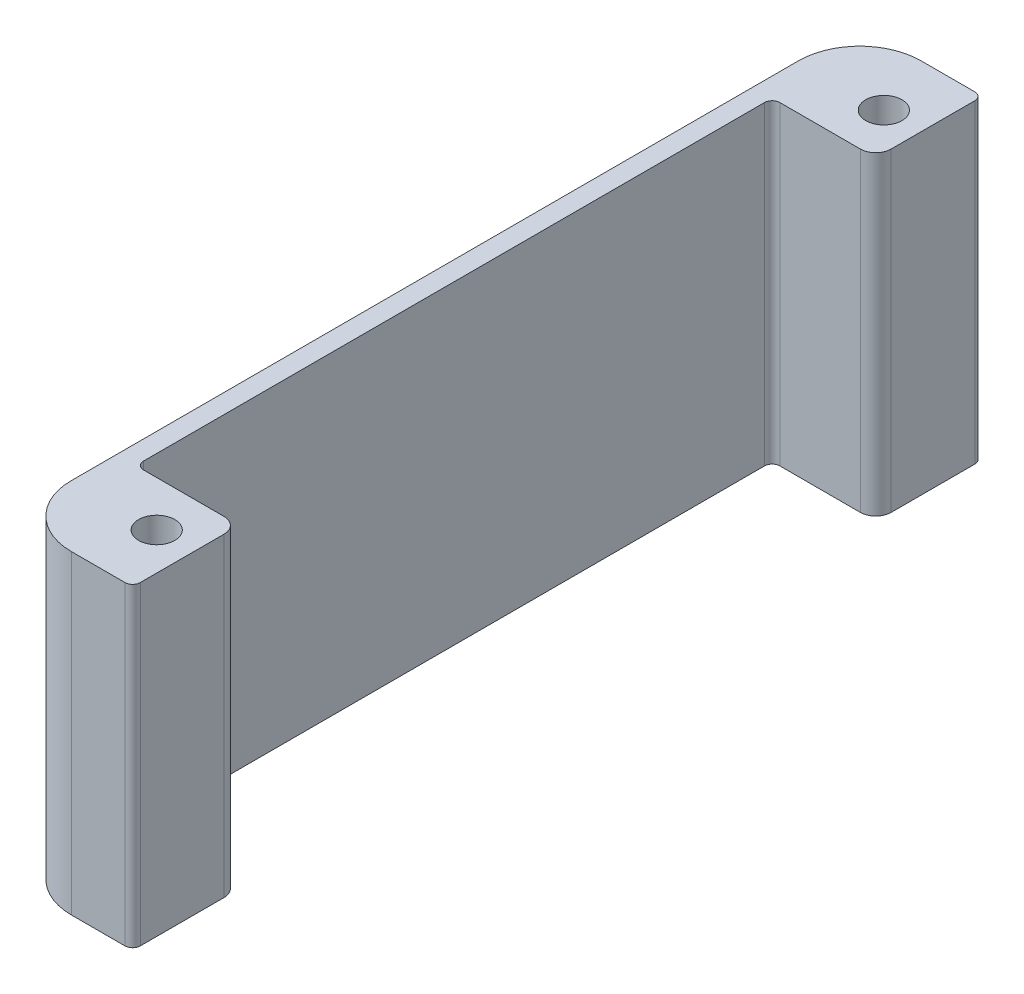
ISO-10303-21;
HEADER;
FILE_DESCRIPTION(('STEP AP214'),'2;1');
FILE_NAME('part.step','',(''),(''),'','','');
FILE_SCHEMA(('AUTOMOTIVE_DESIGN { 1 0 10303 214 1 1 1 1 }'));
ENDSEC;
DATA;
#1=APPLICATION_CONTEXT('core data for automotive mechanical design processes');
#2=APPLICATION_PROTOCOL_DEFINITION('international standard','automotive_design',2000,#1);
#3=PRODUCT_CONTEXT('',#1,'mechanical');
#4=PRODUCT('Part','Part','',(#3));
#5=PRODUCT_RELATED_PRODUCT_CATEGORY('part','',(#4));
#6=PRODUCT_DEFINITION_FORMATION('','',#4);
#7=PRODUCT_DEFINITION_CONTEXT('part definition',#1,'design');
#8=PRODUCT_DEFINITION('design','',#6,#7);
#9=PRODUCT_DEFINITION_SHAPE('','',#8);
#10=(LENGTH_UNIT() NAMED_UNIT(*) SI_UNIT(.MILLI.,.METRE.));
#11=(NAMED_UNIT(*) PLANE_ANGLE_UNIT() SI_UNIT($,.RADIAN.));
#12=(NAMED_UNIT(*) SI_UNIT($,.STERADIAN.) SOLID_ANGLE_UNIT());
#13=UNCERTAINTY_MEASURE_WITH_UNIT(LENGTH_MEASURE(1.E-05),#10,'distance_accuracy_value','');
#14=(GEOMETRIC_REPRESENTATION_CONTEXT(3) GLOBAL_UNCERTAINTY_ASSIGNED_CONTEXT((#13)) GLOBAL_UNIT_ASSIGNED_CONTEXT((#10,
#11,#12)) REPRESENTATION_CONTEXT('',''));
#15=CARTESIAN_POINT('',(0.,0.,0.));
#16=DIRECTION('',(0.,0.,1.));
#17=DIRECTION('',(1.,0.,0.));
#18=AXIS2_PLACEMENT_3D('',#15,#16,#17);
#19=CARTESIAN_POINT('',(3.175,52.09999994,0.));
#20=DIRECTION('',(-1.,0.,0.));
#21=DIRECTION('',(0.,0.,1.));
#22=AXIS2_PLACEMENT_3D('',#19,#20,#21);
#23=PLANE('',#22);
#24=DIRECTION('',(0.,0.,-1.));
#25=VECTOR('',#24,1.);
#26=CARTESIAN_POINT('',(3.175,52.09999994,0.));
#27=LINE('',#26,#25);
#28=CARTESIAN_POINT('',(3.175,52.09999994,-8.7836403590184));
#29=VERTEX_POINT('',#28);
#30=CARTESIAN_POINT('',(3.175,52.09999994,-111.586959640982));
#31=VERTEX_POINT('',#30);
#32=EDGE_CURVE('E191',#29,#31,#27,.T.);
#33=ORIENTED_EDGE('',*,*,#32,.F.);
#34=DIRECTION('',(0.,1.,0.));
#35=VECTOR('',#34,1.);
#36=CARTESIAN_POINT('',(3.175,52.09999994,-8.7836403590184));
#37=LINE('',#36,#35);
#38=CARTESIAN_POINT('',(3.175,0.,-8.7836403590184));
#39=VERTEX_POINT('',#38);
#40=EDGE_CURVE('E240',#29,#39,#37,.F.);
#41=ORIENTED_EDGE('',*,*,#40,.T.);
#42=DIRECTION('',(0.,0.,-1.));
#43=VECTOR('',#42,1.);
#44=CARTESIAN_POINT('',(3.175,0.,0.));
#45=LINE('',#44,#43);
#46=CARTESIAN_POINT('',(3.175,0.,-111.586959640982));
#47=VERTEX_POINT('',#46);
#48=EDGE_CURVE('E179',#39,#47,#45,.T.);
#49=ORIENTED_EDGE('',*,*,#48,.T.);
#50=DIRECTION('',(0.,1.,0.));
#51=VECTOR('',#50,1.);
#52=CARTESIAN_POINT('',(3.175,52.09999994,-111.586959640982));
#53=LINE('',#52,#51);
#54=EDGE_CURVE('E227',#47,#31,#53,.T.);
#55=ORIENTED_EDGE('',*,*,#54,.T.);
#56=EDGE_LOOP('',(#33,#41,#49,#55));
#57=FACE_BOUND('',#56,.T.);
#58=ADVANCED_FACE('F38',(#57),#23,.F.);
#59=CARTESIAN_POINT('',(20.32,52.09999994,0.));
#60=DIRECTION('',(1.,0.,0.));
#61=DIRECTION('',(0.,0.,-1.));
#62=AXIS2_PLACEMENT_3D('',#59,#60,#61);
#63=PLANE('',#62);
#64=DIRECTION('',(0.,0.,1.));
#65=VECTOR('',#64,1.);
#66=CARTESIAN_POINT('',(20.32,0.,0.));
#67=LINE('',#66,#65);
#68=CARTESIAN_POINT('',(20.32,0.,-129.2606));
#69=VERTEX_POINT('',#68);
#70=CARTESIAN_POINT('',(20.32,0.,-115.396959640982));
#71=VERTEX_POINT('',#70);
#72=EDGE_CURVE('E194',#69,#71,#67,.T.);
#73=ORIENTED_EDGE('',*,*,#72,.F.);
#74=DIRECTION('',(0.,-1.,0.));
#75=VECTOR('',#74,1.);
#76=CARTESIAN_POINT('',(20.32,52.09999994,-129.2606));
#77=LINE('',#76,#75);
#78=CARTESIAN_POINT('',(20.32,52.09999994,-129.2606));
#79=VERTEX_POINT('',#78);
#80=EDGE_CURVE('E261',#69,#79,#77,.F.);
#81=ORIENTED_EDGE('',*,*,#80,.T.);
#82=DIRECTION('',(0.,0.,1.));
#83=VECTOR('',#82,1.);
#84=CARTESIAN_POINT('',(20.32,52.09999994,0.));
#85=LINE('',#84,#83);
#86=CARTESIAN_POINT('',(20.32,52.09999994,-115.396959640982));
#87=VERTEX_POINT('',#86);
#88=EDGE_CURVE('E177',#79,#87,#85,.T.);
#89=ORIENTED_EDGE('',*,*,#88,.T.);
#90=DIRECTION('',(0.,1.,0.));
#91=VECTOR('',#90,1.);
#92=CARTESIAN_POINT('',(20.32,0.,-115.396959640982));
#93=LINE('',#92,#91);
#94=EDGE_CURVE('E221',#87,#71,#93,.F.);
#95=ORIENTED_EDGE('',*,*,#94,.T.);
#96=EDGE_LOOP('',(#73,#81,#89,#95));
#97=FACE_BOUND('',#96,.T.);
#98=ADVANCED_FACE('F302',(#97),#63,.T.);
#99=CARTESIAN_POINT('',(0.,52.09999994,-130.5306));
#100=DIRECTION('',(0.,0.,-1.));
#101=DIRECTION('',(-1.,0.,0.));
#102=AXIS2_PLACEMENT_3D('',#99,#100,#101);
#103=PLANE('',#102);
#104=DIRECTION('',(1.,0.,0.));
#105=VECTOR('',#104,1.);
#106=CARTESIAN_POINT('',(0.,52.09999994,-130.5306));
#107=LINE('',#106,#105);
#108=CARTESIAN_POINT('',(10.16,52.09999994,-130.5306));
#109=VERTEX_POINT('',#108);
#110=CARTESIAN_POINT('',(19.05,52.09999994,-130.5306));
#111=VERTEX_POINT('',#110);
#112=EDGE_CURVE('E155',#109,#111,#107,.T.);
#113=ORIENTED_EDGE('',*,*,#112,.T.);
#114=DIRECTION('',(0.,-1.,0.));
#115=VECTOR('',#114,1.);
#116=CARTESIAN_POINT('',(19.05,52.09999994,-130.5306));
#117=LINE('',#116,#115);
#118=CARTESIAN_POINT('',(19.05,0.,-130.5306));
#119=VERTEX_POINT('',#118);
#120=EDGE_CURVE('E259',#111,#119,#117,.T.);
#121=ORIENTED_EDGE('',*,*,#120,.T.);
#122=DIRECTION('',(1.,0.,0.));
#123=VECTOR('',#122,1.);
#124=CARTESIAN_POINT('',(0.,0.,-130.5306));
#125=LINE('',#124,#123);
#126=CARTESIAN_POINT('',(10.16,0.,-130.5306));
#127=VERTEX_POINT('',#126);
#128=EDGE_CURVE('E158',#127,#119,#125,.T.);
#129=ORIENTED_EDGE('',*,*,#128,.F.);
#130=DIRECTION('',(0.,-1.,0.));
#131=VECTOR('',#130,1.);
#132=CARTESIAN_POINT('',(10.16,52.09999994,-130.5306));
#133=LINE('',#132,#131);
#134=EDGE_CURVE('E150',#109,#127,#133,.T.);
#135=ORIENTED_EDGE('',*,*,#134,.F.);
#136=EDGE_LOOP('',(#113,#121,#129,#135));
#137=FACE_BOUND('',#136,.T.);
#138=ADVANCED_FACE('F152',(#137),#103,.T.);
#139=CARTESIAN_POINT('',(10.16,52.09999994,-120.3706));
#140=DIRECTION('',(0.,-1.,0.));
#141=DIRECTION('',(0.,0.,-1.));
#142=AXIS2_PLACEMENT_3D('',#139,#140,#141);
#143=CYLINDRICAL_SURFACE('',#142,10.16);
#144=CARTESIAN_POINT('',(10.16,0.,-120.3706));
#145=DIRECTION('',(0.,1.,0.));
#146=DIRECTION('',(0.,0.,1.));
#147=AXIS2_PLACEMENT_3D('',#144,#145,#146);
#148=CIRCLE('',#147,10.16);
#149=CARTESIAN_POINT('',(0.,0.,-120.3706));
#150=VERTEX_POINT('',#149);
#151=EDGE_CURVE('E198',#127,#150,#148,.T.);
#152=ORIENTED_EDGE('',*,*,#151,.T.);
#153=DIRECTION('',(0.,-1.,0.));
#154=VECTOR('',#153,1.);
#155=CARTESIAN_POINT('',(0.,52.09999994,-120.3706));
#156=LINE('',#155,#154);
#157=CARTESIAN_POINT('',(0.,52.09999994,-120.3706));
#158=VERTEX_POINT('',#157);
#159=EDGE_CURVE('E163',#158,#150,#156,.T.);
#160=ORIENTED_EDGE('',*,*,#159,.F.);
#161=CARTESIAN_POINT('',(10.16,52.09999994,-120.3706));
#162=DIRECTION('',(0.,1.,0.));
#163=DIRECTION('',(0.,0.,1.));
#164=AXIS2_PLACEMENT_3D('',#161,#162,#163);
#165=CIRCLE('',#164,10.16);
#166=EDGE_CURVE('E166',#109,#158,#165,.T.);
#167=ORIENTED_EDGE('',*,*,#166,.F.);
#168=ORIENTED_EDGE('',*,*,#134,.T.);
#169=EDGE_LOOP('',(#152,#160,#167,#168));
#170=FACE_BOUND('',#169,.T.);
#171=ADVANCED_FACE('F167',(#170),#143,.T.);
#172=CARTESIAN_POINT('',(0.,52.09999994,0.));
#173=DIRECTION('',(-1.,0.,0.));
#174=DIRECTION('',(0.,0.,1.));
#175=AXIS2_PLACEMENT_3D('',#172,#173,#174);
#176=PLANE('',#175);
#177=DIRECTION('',(0.,0.,-1.));
#178=VECTOR('',#177,1.);
#179=CARTESIAN_POINT('',(0.,0.,0.));
#180=LINE('',#179,#178);
#181=CARTESIAN_POINT('',(0.,0.,0.));
#182=VERTEX_POINT('',#181);
#183=EDGE_CURVE('E200',#182,#150,#180,.T.);
#184=ORIENTED_EDGE('',*,*,#183,.F.);
#185=DIRECTION('',(0.,-1.,0.));
#186=VECTOR('',#185,1.);
#187=CARTESIAN_POINT('',(0.,52.09999994,0.));
#188=LINE('',#187,#186);
#189=CARTESIAN_POINT('',(0.,52.09999994,0.));
#190=VERTEX_POINT('',#189);
#191=EDGE_CURVE('E213',#190,#182,#188,.T.);
#192=ORIENTED_EDGE('',*,*,#191,.F.);
#193=DIRECTION('',(0.,0.,-1.));
#194=VECTOR('',#193,1.);
#195=CARTESIAN_POINT('',(0.,52.09999994,0.));
#196=LINE('',#195,#194);
#197=EDGE_CURVE('E170',#190,#158,#196,.T.);
#198=ORIENTED_EDGE('',*,*,#197,.T.);
#199=ORIENTED_EDGE('',*,*,#159,.T.);
#200=EDGE_LOOP('',(#184,#192,#198,#199));
#201=FACE_BOUND('',#200,.T.);
#202=ADVANCED_FACE('F292',(#201),#176,.T.);
#203=CARTESIAN_POINT('',(10.16,52.09999994,0.));
#204=DIRECTION('',(0.,-1.,0.));
#205=DIRECTION('',(0.,0.,-1.));
#206=AXIS2_PLACEMENT_3D('',#203,#204,#205);
#207=CYLINDRICAL_SURFACE('',#206,10.16);
#208=CARTESIAN_POINT('',(10.16,0.,0.));
#209=DIRECTION('',(0.,1.,0.));
#210=DIRECTION('',(0.,0.,1.));
#211=AXIS2_PLACEMENT_3D('',#208,#209,#210);
#212=CIRCLE('',#211,10.16);
#213=CARTESIAN_POINT('',(10.16,0.,10.16));
#214=VERTEX_POINT('',#213);
#215=EDGE_CURVE('E203',#214,#182,#212,.F.);
#216=ORIENTED_EDGE('',*,*,#215,.F.);
#217=DIRECTION('',(0.,-1.,0.));
#218=VECTOR('',#217,1.);
#219=CARTESIAN_POINT('',(10.16,52.09999994,10.16));
#220=LINE('',#219,#218);
#221=CARTESIAN_POINT('',(10.16,52.09999994,10.16));
#222=VERTEX_POINT('',#221);
#223=EDGE_CURVE('E193',#222,#214,#220,.T.);
#224=ORIENTED_EDGE('',*,*,#223,.F.);
#225=CARTESIAN_POINT('',(10.16,52.09999994,0.));
#226=DIRECTION('',(0.,1.,0.));
#227=DIRECTION('',(0.,0.,1.));
#228=AXIS2_PLACEMENT_3D('',#225,#226,#227);
#229=CIRCLE('',#228,10.16);
#230=EDGE_CURVE('E184',#222,#190,#229,.F.);
#231=ORIENTED_EDGE('',*,*,#230,.T.);
#232=ORIENTED_EDGE('',*,*,#191,.T.);
#233=EDGE_LOOP('',(#216,#224,#231,#232));
#234=FACE_BOUND('',#233,.T.);
#235=ADVANCED_FACE('F289',(#234),#207,.T.);
#236=CARTESIAN_POINT('',(0.,52.09999994,10.16));
#237=DIRECTION('',(0.,0.,1.));
#238=DIRECTION('',(1.,0.,0.));
#239=AXIS2_PLACEMENT_3D('',#236,#237,#238);
#240=PLANE('',#239);
#241=DIRECTION('',(-1.,0.,0.));
#242=VECTOR('',#241,1.);
#243=CARTESIAN_POINT('',(0.,0.,10.16));
#244=LINE('',#243,#242);
#245=CARTESIAN_POINT('',(19.05,0.,10.16));
#246=VERTEX_POINT('',#245);
#247=EDGE_CURVE('E206',#246,#214,#244,.T.);
#248=ORIENTED_EDGE('',*,*,#247,.F.);
#249=DIRECTION('',(0.,-1.,0.));
#250=VECTOR('',#249,1.);
#251=CARTESIAN_POINT('',(19.05,52.09999994,10.16));
#252=LINE('',#251,#250);
#253=CARTESIAN_POINT('',(19.05,52.09999994,10.16));
#254=VERTEX_POINT('',#253);
#255=EDGE_CURVE('E253',#246,#254,#252,.F.);
#256=ORIENTED_EDGE('',*,*,#255,.T.);
#257=DIRECTION('',(-1.,0.,0.));
#258=VECTOR('',#257,1.);
#259=CARTESIAN_POINT('',(0.,52.09999994,10.16));
#260=LINE('',#259,#258);
#261=EDGE_CURVE('E187',#254,#222,#260,.T.);
#262=ORIENTED_EDGE('',*,*,#261,.T.);
#263=ORIENTED_EDGE('',*,*,#223,.T.);
#264=EDGE_LOOP('',(#248,#256,#262,#263));
#265=FACE_BOUND('',#264,.T.);
#266=ADVANCED_FACE('F285',(#265),#240,.T.);
#267=CARTESIAN_POINT('',(20.32,52.09999994,0.));
#268=DIRECTION('',(1.,0.,0.));
#269=DIRECTION('',(0.,0.,-1.));
#270=AXIS2_PLACEMENT_3D('',#267,#268,#269);
#271=PLANE('',#270);
#272=DIRECTION('',(0.,0.,1.));
#273=VECTOR('',#272,1.);
#274=CARTESIAN_POINT('',(20.32,0.,0.));
#275=LINE('',#274,#273);
#276=CARTESIAN_POINT('',(20.32,0.,-4.9736403590184));
#277=VERTEX_POINT('',#276);
#278=CARTESIAN_POINT('',(20.32,0.,8.89000000000002));
#279=VERTEX_POINT('',#278);
#280=EDGE_CURVE('E208',#277,#279,#275,.T.);
#281=ORIENTED_EDGE('',*,*,#280,.F.);
#282=DIRECTION('',(0.,1.,0.));
#283=VECTOR('',#282,1.);
#284=CARTESIAN_POINT('',(20.32,52.09999994,-4.9736403590184));
#285=LINE('',#284,#283);
#286=CARTESIAN_POINT('',(20.32,52.09999994,-4.9736403590184));
#287=VERTEX_POINT('',#286);
#288=EDGE_CURVE('E263',#277,#287,#285,.T.);
#289=ORIENTED_EDGE('',*,*,#288,.T.);
#290=DIRECTION('',(0.,0.,1.));
#291=VECTOR('',#290,1.);
#292=CARTESIAN_POINT('',(20.32,52.09999994,0.));
#293=LINE('',#292,#291);
#294=CARTESIAN_POINT('',(20.32,52.09999994,8.89000000000002));
#295=VERTEX_POINT('',#294);
#296=EDGE_CURVE('E189',#287,#295,#293,.T.);
#297=ORIENTED_EDGE('',*,*,#296,.T.);
#298=DIRECTION('',(0.,-1.,0.));
#299=VECTOR('',#298,1.);
#300=CARTESIAN_POINT('',(20.32,52.09999994,8.89000000000002));
#301=LINE('',#300,#299);
#302=EDGE_CURVE('E246',#295,#279,#301,.T.);
#303=ORIENTED_EDGE('',*,*,#302,.T.);
#304=EDGE_LOOP('',(#281,#289,#297,#303));
#305=FACE_BOUND('',#304,.T.);
#306=ADVANCED_FACE('F269',(#305),#271,.T.);
#307=CARTESIAN_POINT('',(0.,52.09999994,0.));
#308=DIRECTION('',(0.,1.,0.));
#309=DIRECTION('',(0.,0.,1.));
#310=AXIS2_PLACEMENT_3D('',#307,#308,#309);
#311=PLANE('',#310);
#312=ORIENTED_EDGE('',*,*,#296,.F.);
#313=CARTESIAN_POINT('',(17.78,52.09999994,-4.9736403590184));
#314=DIRECTION('',(0.,1.,0.));
#315=DIRECTION('',(0.,0.,1.));
#316=AXIS2_PLACEMENT_3D('',#313,#314,#315);
#317=CIRCLE('',#316,2.54);
#318=CARTESIAN_POINT('',(17.78,52.09999994,-7.5136403590184));
#319=VERTEX_POINT('',#318);
#320=EDGE_CURVE('E60',#287,#319,#317,.T.);
#321=ORIENTED_EDGE('',*,*,#320,.T.);
#322=DIRECTION('',(-1.,0.,0.));
#323=VECTOR('',#322,1.);
#324=CARTESIAN_POINT('',(0.,52.09999994,-7.5136403590184));
#325=LINE('',#324,#323);
#326=CARTESIAN_POINT('',(4.445,52.09999994,-7.5136403590184));
#327=VERTEX_POINT('',#326);
#328=EDGE_CURVE('E511',#319,#327,#325,.T.);
#329=ORIENTED_EDGE('',*,*,#328,.T.);
#330=CARTESIAN_POINT('',(4.445,52.09999994,-8.7836403590184));
#331=DIRECTION('',(0.,1.,0.));
#332=DIRECTION('',(0.,0.,1.));
#333=AXIS2_PLACEMENT_3D('',#330,#331,#332);
#334=CIRCLE('',#333,1.27);
#335=EDGE_CURVE('E242',#327,#29,#334,.F.);
#336=ORIENTED_EDGE('',*,*,#335,.T.);
#337=ORIENTED_EDGE('',*,*,#32,.T.);
#338=CARTESIAN_POINT('',(4.445,52.09999994,-111.586959640982));
#339=DIRECTION('',(0.,1.,0.));
#340=DIRECTION('',(0.,0.,1.));
#341=AXIS2_PLACEMENT_3D('',#338,#339,#340);
#342=CIRCLE('',#341,1.27);
#343=CARTESIAN_POINT('',(4.445,52.09999994,-112.856959640982));
#344=VERTEX_POINT('',#343);
#345=EDGE_CURVE('E232',#31,#344,#342,.F.);
#346=ORIENTED_EDGE('',*,*,#345,.T.);
#347=DIRECTION('',(-1.,0.,0.));
#348=VECTOR('',#347,1.);
#349=CARTESIAN_POINT('',(0.,52.09999994,-112.856959640982));
#350=LINE('',#349,#348);
#351=CARTESIAN_POINT('',(17.78,52.09999994,-112.856959640982));
#352=VERTEX_POINT('',#351);
#353=EDGE_CURVE('E508',#352,#344,#350,.T.);
#354=ORIENTED_EDGE('',*,*,#353,.F.);
#355=CARTESIAN_POINT('',(17.78,52.09999994,-115.396959640982));
#356=DIRECTION('',(0.,1.,0.));
#357=DIRECTION('',(0.,0.,1.));
#358=AXIS2_PLACEMENT_3D('',#355,#356,#357);
#359=CIRCLE('',#358,2.54);
#360=EDGE_CURVE('E218',#352,#87,#359,.T.);
#361=ORIENTED_EDGE('',*,*,#360,.T.);
#362=ORIENTED_EDGE('',*,*,#88,.F.);
#363=CARTESIAN_POINT('',(19.05,52.09999994,-129.2606));
#364=DIRECTION('',(0.,1.,0.));
#365=DIRECTION('',(0.,0.,1.));
#366=AXIS2_PLACEMENT_3D('',#363,#364,#365);
#367=CIRCLE('',#366,1.27);
#368=EDGE_CURVE('E176',#79,#111,#367,.T.);
#369=ORIENTED_EDGE('',*,*,#368,.T.);
#370=ORIENTED_EDGE('',*,*,#112,.F.);
#371=ORIENTED_EDGE('',*,*,#166,.T.);
#372=ORIENTED_EDGE('',*,*,#197,.F.);
#373=ORIENTED_EDGE('',*,*,#230,.F.);
#374=ORIENTED_EDGE('',*,*,#261,.F.);
#375=CARTESIAN_POINT('',(19.05,52.09999994,8.89000000000002));
#376=DIRECTION('',(0.,1.,0.));
#377=DIRECTION('',(0.,0.,1.));
#378=AXIS2_PLACEMENT_3D('',#375,#376,#377);
#379=CIRCLE('',#378,1.27);
#380=EDGE_CURVE('E256',#254,#295,#379,.T.);
#381=ORIENTED_EDGE('',*,*,#380,.T.);
#382=EDGE_LOOP('',(#312,#321,#329,#336,#337,#346,#354,#361,#362,#369,#370,#371,#372,#373,#374,#381));
#383=FACE_BOUND('',#382,.T.);
#384=CARTESIAN_POINT('',(14.1478,52.09999994,-120.3706));
#385=DIRECTION('',(0.,1.,0.));
#386=DIRECTION('',(0.,0.,1.));
#387=AXIS2_PLACEMENT_3D('',#384,#385,#386);
#388=CIRCLE('',#387,3.);
#389=CARTESIAN_POINT('',(14.1478,52.09999994,-117.3706));
#390=VERTEX_POINT('',#389);
#391=EDGE_CURVE('E504',#390,#390,#388,.T.);
#392=ORIENTED_EDGE('',*,*,#391,.F.);
#393=EDGE_LOOP('',(#392));
#394=FACE_BOUND('',#393,.T.);
#395=CARTESIAN_POINT('',(14.1478,52.09999994,0.));
#396=DIRECTION('',(0.,-1.,0.));
#397=DIRECTION('',(0.,0.,-1.));
#398=AXIS2_PLACEMENT_3D('',#395,#396,#397);
#399=CIRCLE('',#398,3.);
#400=CARTESIAN_POINT('',(14.1478,52.09999994,3.00000000000005));
#401=VERTEX_POINT('',#400);
#402=EDGE_CURVE('E532',#401,#401,#399,.T.);
#403=ORIENTED_EDGE('',*,*,#402,.T.);
#404=EDGE_LOOP('',(#403));
#405=FACE_BOUND('',#404,.T.);
#406=ADVANCED_FACE('F172',(#383,#394,#405),#311,.T.);
#407=CARTESIAN_POINT('',(0.,0.,0.));
#408=DIRECTION('',(0.,1.,0.));
#409=DIRECTION('',(0.,0.,1.));
#410=AXIS2_PLACEMENT_3D('',#407,#408,#409);
#411=PLANE('',#410);
#412=DIRECTION('',(1.,0.,0.));
#413=VECTOR('',#412,1.);
#414=CARTESIAN_POINT('',(0.,0.,-7.5136403590184));
#415=LINE('',#414,#413);
#416=CARTESIAN_POINT('',(4.445,0.,-7.5136403590184));
#417=VERTEX_POINT('',#416);
#418=CARTESIAN_POINT('',(17.78,0.,-7.5136403590184));
#419=VERTEX_POINT('',#418);
#420=EDGE_CURVE('E500',#417,#419,#415,.T.);
#421=ORIENTED_EDGE('',*,*,#420,.T.);
#422=CARTESIAN_POINT('',(17.78,0.,-4.9736403590184));
#423=DIRECTION('',(0.,1.,0.));
#424=DIRECTION('',(0.,0.,1.));
#425=AXIS2_PLACEMENT_3D('',#422,#423,#424);
#426=CIRCLE('',#425,2.54);
#427=EDGE_CURVE('E11',#419,#277,#426,.F.);
#428=ORIENTED_EDGE('',*,*,#427,.T.);
#429=ORIENTED_EDGE('',*,*,#280,.T.);
#430=CARTESIAN_POINT('',(19.05,0.,8.89000000000002));
#431=DIRECTION('',(0.,1.,0.));
#432=DIRECTION('',(0.,0.,1.));
#433=AXIS2_PLACEMENT_3D('',#430,#431,#432);
#434=CIRCLE('',#433,1.27);
#435=EDGE_CURVE('E251',#279,#246,#434,.F.);
#436=ORIENTED_EDGE('',*,*,#435,.T.);
#437=ORIENTED_EDGE('',*,*,#247,.T.);
#438=ORIENTED_EDGE('',*,*,#215,.T.);
#439=ORIENTED_EDGE('',*,*,#183,.T.);
#440=ORIENTED_EDGE('',*,*,#151,.F.);
#441=ORIENTED_EDGE('',*,*,#128,.T.);
#442=CARTESIAN_POINT('',(19.05,0.,-129.2606));
#443=DIRECTION('',(0.,1.,0.));
#444=DIRECTION('',(0.,0.,1.));
#445=AXIS2_PLACEMENT_3D('',#442,#443,#444);
#446=CIRCLE('',#445,1.27);
#447=EDGE_CURVE('E249',#119,#69,#446,.F.);
#448=ORIENTED_EDGE('',*,*,#447,.T.);
#449=ORIENTED_EDGE('',*,*,#72,.T.);
#450=CARTESIAN_POINT('',(17.78,0.,-115.396959640982));
#451=DIRECTION('',(0.,1.,0.));
#452=DIRECTION('',(0.,0.,1.));
#453=AXIS2_PLACEMENT_3D('',#450,#451,#452);
#454=CIRCLE('',#453,2.54);
#455=CARTESIAN_POINT('',(17.78,0.,-112.856959640982));
#456=VERTEX_POINT('',#455);
#457=EDGE_CURVE('E224',#71,#456,#454,.F.);
#458=ORIENTED_EDGE('',*,*,#457,.T.);
#459=DIRECTION('',(1.,0.,0.));
#460=VECTOR('',#459,1.);
#461=CARTESIAN_POINT('',(0.,0.,-112.856959640982));
#462=LINE('',#461,#460);
#463=CARTESIAN_POINT('',(4.445,0.,-112.856959640982));
#464=VERTEX_POINT('',#463);
#465=EDGE_CURVE('E515',#464,#456,#462,.T.);
#466=ORIENTED_EDGE('',*,*,#465,.F.);
#467=CARTESIAN_POINT('',(4.445,0.,-111.586959640982));
#468=DIRECTION('',(0.,1.,0.));
#469=DIRECTION('',(0.,0.,1.));
#470=AXIS2_PLACEMENT_3D('',#467,#468,#469);
#471=CIRCLE('',#470,1.27);
#472=EDGE_CURVE('E234',#464,#47,#471,.T.);
#473=ORIENTED_EDGE('',*,*,#472,.T.);
#474=ORIENTED_EDGE('',*,*,#48,.F.);
#475=CARTESIAN_POINT('',(4.445,0.,-8.7836403590184));
#476=DIRECTION('',(0.,1.,0.));
#477=DIRECTION('',(0.,0.,1.));
#478=AXIS2_PLACEMENT_3D('',#475,#476,#477);
#479=CIRCLE('',#478,1.27);
#480=EDGE_CURVE('E244',#39,#417,#479,.T.);
#481=ORIENTED_EDGE('',*,*,#480,.T.);
#482=EDGE_LOOP('',(#421,#428,#429,#436,#437,#438,#439,#440,#441,#448,#449,#458,#466,#473,#474,#481));
#483=FACE_BOUND('',#482,.T.);
#484=CARTESIAN_POINT('',(14.1478,0.,-120.3706));
#485=DIRECTION('',(0.,1.,0.));
#486=DIRECTION('',(0.,0.,1.));
#487=AXIS2_PLACEMENT_3D('',#484,#485,#486);
#488=CIRCLE('',#487,3.);
#489=CARTESIAN_POINT('',(14.1478,0.,-117.3706));
#490=VERTEX_POINT('',#489);
#491=EDGE_CURVE('E196',#490,#490,#488,.F.);
#492=ORIENTED_EDGE('',*,*,#491,.F.);
#493=EDGE_LOOP('',(#492));
#494=FACE_BOUND('',#493,.T.);
#495=CARTESIAN_POINT('',(14.1478,0.,0.));
#496=DIRECTION('',(0.,1.,0.));
#497=DIRECTION('',(0.,0.,1.));
#498=AXIS2_PLACEMENT_3D('',#495,#496,#497);
#499=CIRCLE('',#498,3.);
#500=CARTESIAN_POINT('',(14.1478,0.,3.00000000000005));
#501=VERTEX_POINT('',#500);
#502=EDGE_CURVE('E505',#501,#501,#499,.T.);
#503=ORIENTED_EDGE('',*,*,#502,.T.);
#504=EDGE_LOOP('',(#503));
#505=FACE_BOUND('',#504,.T.);
#506=ADVANCED_FACE('F282',(#483,#494,#505),#411,.F.);
#507=CARTESIAN_POINT('',(14.1478,-22.4535430892355,-120.3706));
#508=DIRECTION('',(0.,1.,0.));
#509=DIRECTION('',(0.,0.,1.));
#510=AXIS2_PLACEMENT_3D('',#507,#508,#509);
#511=CYLINDRICAL_SURFACE('',#510,3.);
#512=CARTESIAN_POINT('',(14.1478,0.,-117.3706));
#513=CARTESIAN_POINT('',(14.1478,0.54270833270833,-117.3706));
#514=CARTESIAN_POINT('',(14.1478,1.08541666541666,-117.3706));
#515=CARTESIAN_POINT('',(14.1478,2.17083333083333,-117.3706));
#516=CARTESIAN_POINT('',(14.1478,2.71354166354166,-117.3706));
#517=CARTESIAN_POINT('',(14.1478,3.79895832895833,-117.3706));
#518=CARTESIAN_POINT('',(14.1478,4.34166666166667,-117.3706));
#519=CARTESIAN_POINT('',(14.1478,5.42708332708333,-117.3706));
#520=CARTESIAN_POINT('',(14.1478,5.96979165979166,-117.3706));
#521=CARTESIAN_POINT('',(14.1478,7.05520832520833,-117.3706));
#522=CARTESIAN_POINT('',(14.1478,7.59791665791666,-117.3706));
#523=CARTESIAN_POINT('',(14.1478,8.68333332333333,-117.3706));
#524=CARTESIAN_POINT('',(14.1478,9.22604165604166,-117.3706));
#525=CARTESIAN_POINT('',(14.1478,10.3114583214583,-117.3706));
#526=CARTESIAN_POINT('',(14.1478,10.8541666541667,-117.3706));
#527=CARTESIAN_POINT('',(14.1478,11.9395833195833,-117.3706));
#528=CARTESIAN_POINT('',(14.1478,12.4822916522917,-117.3706));
#529=CARTESIAN_POINT('',(14.1478,13.5677083177083,-117.3706));
#530=CARTESIAN_POINT('',(14.1478,14.1104166504167,-117.3706));
#531=CARTESIAN_POINT('',(14.1478,15.1958333158333,-117.3706));
#532=CARTESIAN_POINT('',(14.1478,15.7385416485417,-117.3706));
#533=CARTESIAN_POINT('',(14.1478,16.8239583139583,-117.3706));
#534=CARTESIAN_POINT('',(14.1478,17.3666666466667,-117.3706));
#535=CARTESIAN_POINT('',(14.1478,18.4520833120833,-117.3706));
#536=CARTESIAN_POINT('',(14.1478,18.9947916447917,-117.3706));
#537=CARTESIAN_POINT('',(14.1478,20.0802083102083,-117.3706));
#538=CARTESIAN_POINT('',(14.1478,20.6229166429167,-117.3706));
#539=CARTESIAN_POINT('',(14.1478,21.7083333083333,-117.3706));
#540=CARTESIAN_POINT('',(14.1478,22.2510416410417,-117.3706));
#541=CARTESIAN_POINT('',(14.1478,23.3364583064583,-117.3706));
#542=CARTESIAN_POINT('',(14.1478,23.8791666391667,-117.3706));
#543=CARTESIAN_POINT('',(14.1478,24.9645833045833,-117.3706));
#544=CARTESIAN_POINT('',(14.1478,25.5072916372917,-117.3706));
#545=CARTESIAN_POINT('',(14.1478,26.5927083027083,-117.3706));
#546=CARTESIAN_POINT('',(14.1478,27.1354166354167,-117.3706));
#547=CARTESIAN_POINT('',(14.1478,28.2208333008333,-117.3706));
#548=CARTESIAN_POINT('',(14.1478,28.7635416335417,-117.3706));
#549=CARTESIAN_POINT('',(14.1478,29.8489582989583,-117.3706));
#550=CARTESIAN_POINT('',(14.1478,30.3916666316667,-117.3706));
#551=CARTESIAN_POINT('',(14.1478,31.4770832970833,-117.3706));
#552=CARTESIAN_POINT('',(14.1478,32.0197916297917,-117.3706));
#553=CARTESIAN_POINT('',(14.1478,33.1052082952083,-117.3706));
#554=CARTESIAN_POINT('',(14.1478,33.6479166279167,-117.3706));
#555=CARTESIAN_POINT('',(14.1478,34.7333332933333,-117.3706));
#556=CARTESIAN_POINT('',(14.1478,35.2760416260417,-117.3706));
#557=CARTESIAN_POINT('',(14.1478,36.3614582914583,-117.3706));
#558=CARTESIAN_POINT('',(14.1478,36.9041666241667,-117.3706));
#559=CARTESIAN_POINT('',(14.1478,37.9895832895833,-117.3706));
#560=CARTESIAN_POINT('',(14.1478,38.5322916222917,-117.3706));
#561=CARTESIAN_POINT('',(14.1478,39.6177082877083,-117.3706));
#562=CARTESIAN_POINT('',(14.1478,40.1604166204167,-117.3706));
#563=CARTESIAN_POINT('',(14.1478,41.2458332858333,-117.3706));
#564=CARTESIAN_POINT('',(14.1478,41.7885416185417,-117.3706));
#565=CARTESIAN_POINT('',(14.1478,42.8739582839583,-117.3706));
#566=CARTESIAN_POINT('',(14.1478,43.4166666166667,-117.3706));
#567=CARTESIAN_POINT('',(14.1478,44.5020832820833,-117.3706));
#568=CARTESIAN_POINT('',(14.1478,45.0447916147917,-117.3706));
#569=CARTESIAN_POINT('',(14.1478,46.1302082802083,-117.3706));
#570=CARTESIAN_POINT('',(14.1478,46.6729166129167,-117.3706));
#571=CARTESIAN_POINT('',(14.1478,47.7583332783333,-117.3706));
#572=CARTESIAN_POINT('',(14.1478,48.3010416110417,-117.3706));
#573=CARTESIAN_POINT('',(14.1478,49.3864582764583,-117.3706));
#574=CARTESIAN_POINT('',(14.1478,49.9291666091667,-117.3706));
#575=CARTESIAN_POINT('',(14.1478,51.0145832745833,-117.3706));
#576=CARTESIAN_POINT('',(14.1478,51.5572916072917,-117.3706));
#577=CARTESIAN_POINT('',(14.1478,52.09999994,-117.3706));
#578=B_SPLINE_CURVE_WITH_KNOTS('',3,(#512,#513,#514,#515,#516,#517,#518,#519,#520,#521,#522,
#523,#524,#525,#526,#527,#528,#529,#530,#531,#532,#533,#534,#535,#536,#537,#538,#539,#540,#541,
#542,#543,#544,#545,#546,#547,#548,#549,#550,#551,#552,#553,#554,#555,#556,#557,#558,#559,#560,
#561,#562,#563,#564,#565,#566,#567,#568,#569,#570,#571,#572,#573,#574,#575,#576,#577),
.UNSPECIFIED.,.F.,.F.,(4,2,2,2,2,2,2,2,2,2,2,2,2,2,2,2,2,2,2,2,2,2,2,2,2,2,2,2,2,2,2,2,4),(0.,
1.628124998125,3.25624999625,4.884374994375,6.5124999925,8.140624990625,9.76874998875,
11.396874986875,13.024999985,14.653124983125,16.28124998125,17.909374979375,19.5374999775,
21.165624975625,22.79374997375,24.421874971875,26.04999997,27.678124968125,29.30624996625,
30.934374964375,32.5624999625,34.190624960625,35.81874995875,37.446874956875,39.074999955,
40.703124953125,42.33124995125,43.959374949375,45.5874999475,47.215624945625,48.84374994375,
50.471874941875,52.09999994),.UNSPECIFIED.);
#579=EDGE_CURVE('BSEAM339',#490,#390,#578,.T.);
#580=ORIENTED_EDGE('',*,*,#491,.T.);
#581=ORIENTED_EDGE('',*,*,#391,.T.);
#582=ORIENTED_EDGE('',*,*,#579,.T.);
#583=ORIENTED_EDGE('',*,*,#579,.F.);
#584=EDGE_LOOP('',(#580,#582,#581,#583));
#585=FACE_BOUND('',#584,.T.);
#586=ADVANCED_FACE('F339',(#585),#511,.F.);
#587=CARTESIAN_POINT('',(0.,-22.4535430892355,-112.856959640982));
#588=DIRECTION('',(0.,0.,-1.));
#589=DIRECTION('',(-1.,0.,0.));
#590=AXIS2_PLACEMENT_3D('',#587,#588,#589);
#591=PLANE('',#590);
#592=ORIENTED_EDGE('',*,*,#353,.T.);
#593=DIRECTION('',(0.,1.,0.));
#594=VECTOR('',#593,1.);
#595=CARTESIAN_POINT('',(4.445,0.,-112.856959640982));
#596=LINE('',#595,#594);
#597=EDGE_CURVE('E230',#344,#464,#596,.F.);
#598=ORIENTED_EDGE('',*,*,#597,.T.);
#599=ORIENTED_EDGE('',*,*,#465,.T.);
#600=DIRECTION('',(0.,1.,0.));
#601=VECTOR('',#600,1.);
#602=CARTESIAN_POINT('',(17.78,52.09999994,-112.856959640982));
#603=LINE('',#602,#601);
#604=EDGE_CURVE('E162',#456,#352,#603,.T.);
#605=ORIENTED_EDGE('',*,*,#604,.T.);
#606=EDGE_LOOP('',(#592,#598,#599,#605));
#607=FACE_BOUND('',#606,.T.);
#608=ADVANCED_FACE('F346',(#607),#591,.F.);
#609=CARTESIAN_POINT('',(17.78,-22.4535430892355,-115.396959640982));
#610=DIRECTION('',(0.,-1.,0.));
#611=DIRECTION('',(0.,0.,-1.));
#612=AXIS2_PLACEMENT_3D('',#609,#610,#611);
#613=CYLINDRICAL_SURFACE('',#612,2.54);
#614=ORIENTED_EDGE('',*,*,#457,.F.);
#615=ORIENTED_EDGE('',*,*,#94,.F.);
#616=ORIENTED_EDGE('',*,*,#360,.F.);
#617=ORIENTED_EDGE('',*,*,#604,.F.);
#618=EDGE_LOOP('',(#614,#615,#616,#617));
#619=FACE_BOUND('',#618,.T.);
#620=ADVANCED_FACE('F355',(#619),#613,.T.);
#621=CARTESIAN_POINT('',(4.445,52.09999994,-111.586959640982));
#622=DIRECTION('',(0.,-1.,0.));
#623=DIRECTION('',(0.,0.,-1.));
#624=AXIS2_PLACEMENT_3D('',#621,#622,#623);
#625=CYLINDRICAL_SURFACE('',#624,1.27);
#626=ORIENTED_EDGE('',*,*,#472,.F.);
#627=ORIENTED_EDGE('',*,*,#597,.F.);
#628=ORIENTED_EDGE('',*,*,#345,.F.);
#629=ORIENTED_EDGE('',*,*,#54,.F.);
#630=EDGE_LOOP('',(#626,#627,#628,#629));
#631=FACE_BOUND('',#630,.T.);
#632=ADVANCED_FACE('F363',(#631),#625,.F.);
#633=CARTESIAN_POINT('',(0.,-22.4535430892355,-7.5136403590184));
#634=DIRECTION('',(0.,0.,-1.));
#635=DIRECTION('',(-1.,0.,0.));
#636=AXIS2_PLACEMENT_3D('',#633,#634,#635);
#637=PLANE('',#636);
#638=ORIENTED_EDGE('',*,*,#328,.F.);
#639=DIRECTION('',(0.,1.,0.));
#640=VECTOR('',#639,1.);
#641=CARTESIAN_POINT('',(17.78,-22.4535430892355,-7.5136403590184));
#642=LINE('',#641,#640);
#643=EDGE_CURVE('E46',#319,#419,#642,.F.);
#644=ORIENTED_EDGE('',*,*,#643,.T.);
#645=ORIENTED_EDGE('',*,*,#420,.F.);
#646=DIRECTION('',(0.,1.,0.));
#647=VECTOR('',#646,1.);
#648=CARTESIAN_POINT('',(4.445,-22.4535430892355,-7.5136403590184));
#649=LINE('',#648,#647);
#650=EDGE_CURVE('E237',#417,#327,#649,.T.);
#651=ORIENTED_EDGE('',*,*,#650,.T.);
#652=EDGE_LOOP('',(#638,#644,#645,#651));
#653=FACE_BOUND('',#652,.T.);
#654=ADVANCED_FACE('F370',(#653),#637,.T.);
#655=CARTESIAN_POINT('',(14.1478,-22.4535430892355,0.));
#656=DIRECTION('',(0.,1.,0.));
#657=DIRECTION('',(0.,0.,1.));
#658=AXIS2_PLACEMENT_3D('',#655,#656,#657);
#659=CYLINDRICAL_SURFACE('',#658,3.);
#660=CARTESIAN_POINT('',(14.1478,0.,3.00000000000005));
#661=CARTESIAN_POINT('',(14.1478,0.54270833270833,3.00000000000005));
#662=CARTESIAN_POINT('',(14.1478,1.08541666541666,3.00000000000005));
#663=CARTESIAN_POINT('',(14.1478,2.17083333083333,3.00000000000005));
#664=CARTESIAN_POINT('',(14.1478,2.71354166354166,3.00000000000005));
#665=CARTESIAN_POINT('',(14.1478,3.79895832895833,3.00000000000005));
#666=CARTESIAN_POINT('',(14.1478,4.34166666166667,3.00000000000005));
#667=CARTESIAN_POINT('',(14.1478,5.42708332708333,3.00000000000005));
#668=CARTESIAN_POINT('',(14.1478,5.96979165979166,3.00000000000005));
#669=CARTESIAN_POINT('',(14.1478,7.05520832520833,3.00000000000005));
#670=CARTESIAN_POINT('',(14.1478,7.59791665791666,3.00000000000005));
#671=CARTESIAN_POINT('',(14.1478,8.68333332333333,3.00000000000005));
#672=CARTESIAN_POINT('',(14.1478,9.22604165604166,3.00000000000005));
#673=CARTESIAN_POINT('',(14.1478,10.3114583214583,3.00000000000005));
#674=CARTESIAN_POINT('',(14.1478,10.8541666541667,3.00000000000005));
#675=CARTESIAN_POINT('',(14.1478,11.9395833195833,3.00000000000005));
#676=CARTESIAN_POINT('',(14.1478,12.4822916522917,3.00000000000005));
#677=CARTESIAN_POINT('',(14.1478,13.5677083177083,3.00000000000005));
#678=CARTESIAN_POINT('',(14.1478,14.1104166504167,3.00000000000005));
#679=CARTESIAN_POINT('',(14.1478,15.1958333158333,3.00000000000005));
#680=CARTESIAN_POINT('',(14.1478,15.7385416485417,3.00000000000005));
#681=CARTESIAN_POINT('',(14.1478,16.8239583139583,3.00000000000005));
#682=CARTESIAN_POINT('',(14.1478,17.3666666466667,3.00000000000005));
#683=CARTESIAN_POINT('',(14.1478,18.4520833120833,3.00000000000005));
#684=CARTESIAN_POINT('',(14.1478,18.9947916447917,3.00000000000005));
#685=CARTESIAN_POINT('',(14.1478,20.0802083102083,3.00000000000005));
#686=CARTESIAN_POINT('',(14.1478,20.6229166429167,3.00000000000005));
#687=CARTESIAN_POINT('',(14.1478,21.7083333083333,3.00000000000005));
#688=CARTESIAN_POINT('',(14.1478,22.2510416410417,3.00000000000005));
#689=CARTESIAN_POINT('',(14.1478,23.3364583064583,3.00000000000005));
#690=CARTESIAN_POINT('',(14.1478,23.8791666391667,3.00000000000005));
#691=CARTESIAN_POINT('',(14.1478,24.9645833045833,3.00000000000005));
#692=CARTESIAN_POINT('',(14.1478,25.5072916372917,3.00000000000005));
#693=CARTESIAN_POINT('',(14.1478,26.5927083027083,3.00000000000005));
#694=CARTESIAN_POINT('',(14.1478,27.1354166354167,3.00000000000005));
#695=CARTESIAN_POINT('',(14.1478,28.2208333008333,3.00000000000005));
#696=CARTESIAN_POINT('',(14.1478,28.7635416335417,3.00000000000005));
#697=CARTESIAN_POINT('',(14.1478,29.8489582989583,3.00000000000005));
#698=CARTESIAN_POINT('',(14.1478,30.3916666316667,3.00000000000005));
#699=CARTESIAN_POINT('',(14.1478,31.4770832970833,3.00000000000005));
#700=CARTESIAN_POINT('',(14.1478,32.0197916297917,3.00000000000005));
#701=CARTESIAN_POINT('',(14.1478,33.1052082952083,3.00000000000005));
#702=CARTESIAN_POINT('',(14.1478,33.6479166279167,3.00000000000005));
#703=CARTESIAN_POINT('',(14.1478,34.7333332933333,3.00000000000005));
#704=CARTESIAN_POINT('',(14.1478,35.2760416260417,3.00000000000005));
#705=CARTESIAN_POINT('',(14.1478,36.3614582914583,3.00000000000005));
#706=CARTESIAN_POINT('',(14.1478,36.9041666241667,3.00000000000005));
#707=CARTESIAN_POINT('',(14.1478,37.9895832895833,3.00000000000005));
#708=CARTESIAN_POINT('',(14.1478,38.5322916222917,3.00000000000005));
#709=CARTESIAN_POINT('',(14.1478,39.6177082877083,3.00000000000005));
#710=CARTESIAN_POINT('',(14.1478,40.1604166204167,3.00000000000005));
#711=CARTESIAN_POINT('',(14.1478,41.2458332858333,3.00000000000005));
#712=CARTESIAN_POINT('',(14.1478,41.7885416185417,3.00000000000005));
#713=CARTESIAN_POINT('',(14.1478,42.8739582839583,3.00000000000005));
#714=CARTESIAN_POINT('',(14.1478,43.4166666166667,3.00000000000005));
#715=CARTESIAN_POINT('',(14.1478,44.5020832820833,3.00000000000005));
#716=CARTESIAN_POINT('',(14.1478,45.0447916147917,3.00000000000005));
#717=CARTESIAN_POINT('',(14.1478,46.1302082802083,3.00000000000005));
#718=CARTESIAN_POINT('',(14.1478,46.6729166129167,3.00000000000005));
#719=CARTESIAN_POINT('',(14.1478,47.7583332783333,3.00000000000005));
#720=CARTESIAN_POINT('',(14.1478,48.3010416110417,3.00000000000005));
#721=CARTESIAN_POINT('',(14.1478,49.3864582764583,3.00000000000005));
#722=CARTESIAN_POINT('',(14.1478,49.9291666091667,3.00000000000005));
#723=CARTESIAN_POINT('',(14.1478,51.0145832745833,3.00000000000005));
#724=CARTESIAN_POINT('',(14.1478,51.5572916072917,3.00000000000005));
#725=CARTESIAN_POINT('',(14.1478,52.09999994,3.00000000000005));
#726=B_SPLINE_CURVE_WITH_KNOTS('',3,(#660,#661,#662,#663,#664,#665,#666,#667,#668,#669,#670,
#671,#672,#673,#674,#675,#676,#677,#678,#679,#680,#681,#682,#683,#684,#685,#686,#687,#688,#689,
#690,#691,#692,#693,#694,#695,#696,#697,#698,#699,#700,#701,#702,#703,#704,#705,#706,#707,#708,
#709,#710,#711,#712,#713,#714,#715,#716,#717,#718,#719,#720,#721,#722,#723,#724,#725),
.UNSPECIFIED.,.F.,.F.,(4,2,2,2,2,2,2,2,2,2,2,2,2,2,2,2,2,2,2,2,2,2,2,2,2,2,2,2,2,2,2,2,4),(0.,
1.628124998125,3.25624999625,4.884374994375,6.5124999925,8.140624990625,9.76874998875,
11.396874986875,13.024999985,14.653124983125,16.28124998125,17.909374979375,19.5374999775,
21.165624975625,22.79374997375,24.421874971875,26.04999997,27.678124968125,29.30624996625,
30.934374964375,32.5624999625,34.190624960625,35.81874995875,37.446874956875,39.074999955,
40.703124953125,42.33124995125,43.959374949375,45.5874999475,47.215624945625,48.84374994375,
50.471874941875,52.09999994),.UNSPECIFIED.);
#727=EDGE_CURVE('BSEAM377',#501,#401,#726,.T.);
#728=ORIENTED_EDGE('',*,*,#502,.F.);
#729=ORIENTED_EDGE('',*,*,#402,.F.);
#730=ORIENTED_EDGE('',*,*,#727,.T.);
#731=ORIENTED_EDGE('',*,*,#727,.F.);
#732=EDGE_LOOP('',(#728,#730,#729,#731));
#733=FACE_BOUND('',#732,.T.);
#734=ADVANCED_FACE('F377',(#733),#659,.F.);
#735=CARTESIAN_POINT('',(4.445,-22.4535430892355,-8.7836403590184));
#736=DIRECTION('',(0.,1.,0.));
#737=DIRECTION('',(0.,0.,1.));
#738=AXIS2_PLACEMENT_3D('',#735,#736,#737);
#739=CYLINDRICAL_SURFACE('',#738,1.27);
#740=ORIENTED_EDGE('',*,*,#480,.F.);
#741=ORIENTED_EDGE('',*,*,#40,.F.);
#742=ORIENTED_EDGE('',*,*,#335,.F.);
#743=ORIENTED_EDGE('',*,*,#650,.F.);
#744=EDGE_LOOP('',(#740,#741,#742,#743));
#745=FACE_BOUND('',#744,.T.);
#746=ADVANCED_FACE('F385',(#745),#739,.F.);
#747=CARTESIAN_POINT('',(19.05,52.09999994,8.89000000000002));
#748=DIRECTION('',(0.,-1.,0.));
#749=DIRECTION('',(0.,0.,-1.));
#750=AXIS2_PLACEMENT_3D('',#747,#748,#749);
#751=CYLINDRICAL_SURFACE('',#750,1.27);
#752=ORIENTED_EDGE('',*,*,#380,.F.);
#753=ORIENTED_EDGE('',*,*,#255,.F.);
#754=ORIENTED_EDGE('',*,*,#435,.F.);
#755=ORIENTED_EDGE('',*,*,#302,.F.);
#756=EDGE_LOOP('',(#752,#753,#754,#755));
#757=FACE_BOUND('',#756,.T.);
#758=ADVANCED_FACE('F279',(#757),#751,.T.);
#759=CARTESIAN_POINT('',(19.05,52.09999994,-129.2606));
#760=DIRECTION('',(0.,-1.,0.));
#761=DIRECTION('',(0.,0.,-1.));
#762=AXIS2_PLACEMENT_3D('',#759,#760,#761);
#763=CYLINDRICAL_SURFACE('',#762,1.27);
#764=ORIENTED_EDGE('',*,*,#368,.F.);
#765=ORIENTED_EDGE('',*,*,#80,.F.);
#766=ORIENTED_EDGE('',*,*,#447,.F.);
#767=ORIENTED_EDGE('',*,*,#120,.F.);
#768=EDGE_LOOP('',(#764,#765,#766,#767));
#769=FACE_BOUND('',#768,.T.);
#770=ADVANCED_FACE('F400',(#769),#763,.T.);
#771=CARTESIAN_POINT('',(17.78,52.09999994,-4.9736403590184));
#772=DIRECTION('',(0.,1.,0.));
#773=DIRECTION('',(0.,0.,1.));
#774=AXIS2_PLACEMENT_3D('',#771,#772,#773);
#775=CYLINDRICAL_SURFACE('',#774,2.54);
#776=ORIENTED_EDGE('',*,*,#427,.F.);
#777=ORIENTED_EDGE('',*,*,#643,.F.);
#778=ORIENTED_EDGE('',*,*,#320,.F.);
#779=ORIENTED_EDGE('',*,*,#288,.F.);
#780=EDGE_LOOP('',(#776,#777,#778,#779));
#781=FACE_BOUND('',#780,.T.);
#782=ADVANCED_FACE('F40',(#781),#775,.T.);
#783=CLOSED_SHELL('',(#58,#98,#138,#171,#202,#235,#266,#306,#406,#506,#586,#608,#620,#632,#654,
#734,#746,#758,#770,#782));
#784=MANIFOLD_SOLID_BREP('B2',#783);
#785=ADVANCED_BREP_SHAPE_REPRESENTATION('',(#18,#784),#14);
#786=SHAPE_DEFINITION_REPRESENTATION(#9,#785);
ENDSEC;
END-ISO-10303-21;
